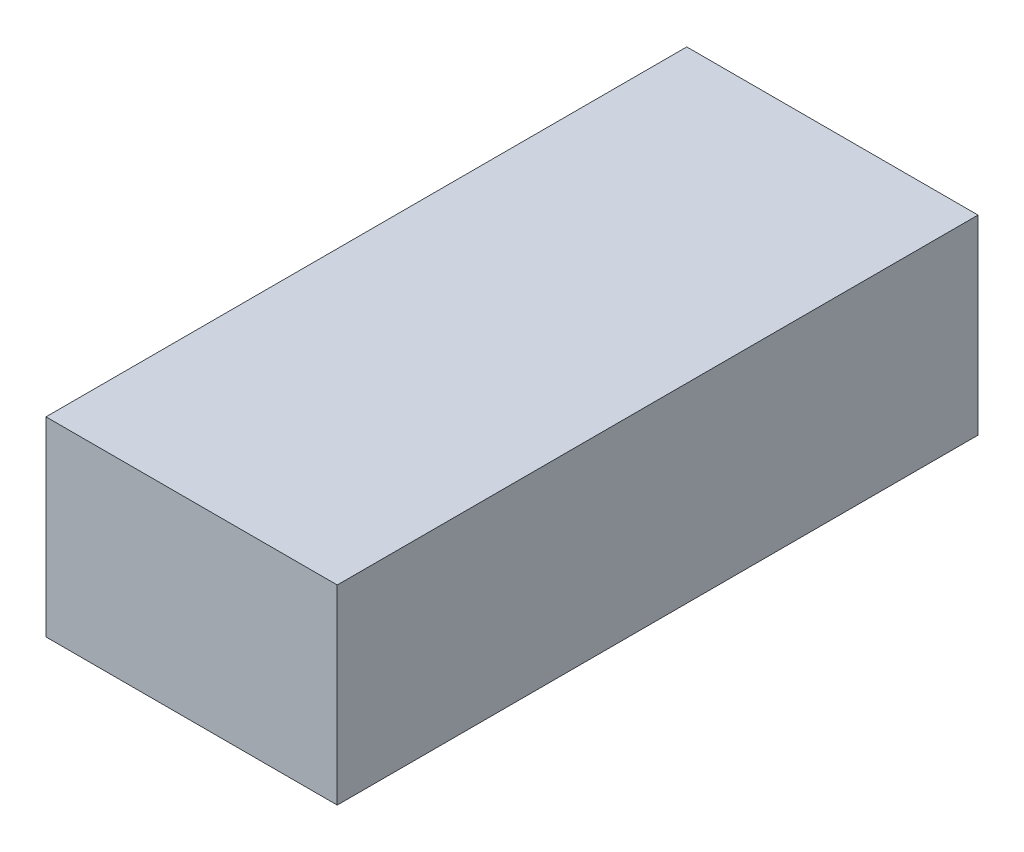
ISO-10303-21;
HEADER;
FILE_DESCRIPTION(('STEP AP214'),'2;1');
FILE_NAME('part.step','',(''),(''),'','','');
FILE_SCHEMA(('AUTOMOTIVE_DESIGN { 1 0 10303 214 1 1 1 1 }'));
ENDSEC;
DATA;
#1=APPLICATION_CONTEXT('core data for automotive mechanical design processes');
#2=APPLICATION_PROTOCOL_DEFINITION('international standard','automotive_design',2000,#1);
#3=PRODUCT_CONTEXT('',#1,'mechanical');
#4=PRODUCT('Part','Part','',(#3));
#5=PRODUCT_RELATED_PRODUCT_CATEGORY('part','',(#4));
#6=PRODUCT_DEFINITION_FORMATION('','',#4);
#7=PRODUCT_DEFINITION_CONTEXT('part definition',#1,'design');
#8=PRODUCT_DEFINITION('design','',#6,#7);
#9=PRODUCT_DEFINITION_SHAPE('','',#8);
#10=(LENGTH_UNIT() NAMED_UNIT(*) SI_UNIT(.MILLI.,.METRE.));
#11=(NAMED_UNIT(*) PLANE_ANGLE_UNIT() SI_UNIT($,.RADIAN.));
#12=(NAMED_UNIT(*) SI_UNIT($,.STERADIAN.) SOLID_ANGLE_UNIT());
#13=UNCERTAINTY_MEASURE_WITH_UNIT(LENGTH_MEASURE(1.E-05),#10,'distance_accuracy_value','');
#14=(GEOMETRIC_REPRESENTATION_CONTEXT(3) GLOBAL_UNCERTAINTY_ASSIGNED_CONTEXT((#13)) GLOBAL_UNIT_ASSIGNED_CONTEXT((#10,
#11,#12)) REPRESENTATION_CONTEXT('',''));
#15=CARTESIAN_POINT('',(0.,0.,0.));
#16=DIRECTION('',(0.,0.,1.));
#17=DIRECTION('',(1.,0.,0.));
#18=AXIS2_PLACEMENT_3D('',#15,#16,#17);
#19=CARTESIAN_POINT('',(0.,0.,0.));
#20=DIRECTION('',(-1.,0.,0.));
#21=DIRECTION('',(0.,0.,1.));
#22=AXIS2_PLACEMENT_3D('',#19,#20,#21);
#23=PLANE('',#22);
#24=DIRECTION('',(0.,1.,0.));
#25=VECTOR('',#24,1.);
#26=CARTESIAN_POINT('',(0.,-36.,-121.));
#27=LINE('',#26,#25);
#28=CARTESIAN_POINT('',(0.,-36.,-121.));
#29=VERTEX_POINT('',#28);
#30=CARTESIAN_POINT('',(0.,36.,-121.));
#31=VERTEX_POINT('',#30);
#32=EDGE_CURVE('E130',#29,#31,#27,.T.);
#33=ORIENTED_EDGE('',*,*,#32,.F.);
#34=DIRECTION('',(0.,0.,-1.));
#35=VECTOR('',#34,1.);
#36=CARTESIAN_POINT('',(0.,-36.,121.));
#37=LINE('',#36,#35);
#38=CARTESIAN_POINT('',(0.,-36.,121.));
#39=VERTEX_POINT('',#38);
#40=EDGE_CURVE('E78',#39,#29,#37,.T.);
#41=ORIENTED_EDGE('',*,*,#40,.F.);
#42=DIRECTION('',(0.,-1.,0.));
#43=VECTOR('',#42,1.);
#44=CARTESIAN_POINT('',(0.,-36.,121.));
#45=LINE('',#44,#43);
#46=CARTESIAN_POINT('',(0.,36.,121.));
#47=VERTEX_POINT('',#46);
#48=EDGE_CURVE('E158',#47,#39,#45,.T.);
#49=ORIENTED_EDGE('',*,*,#48,.F.);
#50=DIRECTION('',(0.,0.,1.));
#51=VECTOR('',#50,1.);
#52=CARTESIAN_POINT('',(0.,36.,121.));
#53=LINE('',#52,#51);
#54=EDGE_CURVE('E134',#31,#47,#53,.T.);
#55=ORIENTED_EDGE('',*,*,#54,.F.);
#56=EDGE_LOOP('',(#33,#41,#49,#55));
#57=FACE_BOUND('',#56,.T.);
#58=DIRECTION('',(0.,0.,-1.));
#59=VECTOR('',#58,1.);
#60=CARTESIAN_POINT('',(0.,-32.,0.));
#61=LINE('',#60,#59);
#62=CARTESIAN_POINT('',(0.,-32.,117.));
#63=VERTEX_POINT('',#62);
#64=CARTESIAN_POINT('',(0.,-32.,-117.));
#65=VERTEX_POINT('',#64);
#66=EDGE_CURVE('E125',#63,#65,#61,.T.);
#67=ORIENTED_EDGE('',*,*,#66,.T.);
#68=DIRECTION('',(0.,1.,0.));
#69=VECTOR('',#68,1.);
#70=CARTESIAN_POINT('',(0.,0.,-117.));
#71=LINE('',#70,#69);
#72=CARTESIAN_POINT('',(0.,32.,-117.));
#73=VERTEX_POINT('',#72);
#74=EDGE_CURVE('E144',#65,#73,#71,.T.);
#75=ORIENTED_EDGE('',*,*,#74,.T.);
#76=DIRECTION('',(0.,0.,1.));
#77=VECTOR('',#76,1.);
#78=CARTESIAN_POINT('',(0.,32.,0.));
#79=LINE('',#78,#77);
#80=CARTESIAN_POINT('',(0.,32.,117.));
#81=VERTEX_POINT('',#80);
#82=EDGE_CURVE('E129',#73,#81,#79,.T.);
#83=ORIENTED_EDGE('',*,*,#82,.T.);
#84=DIRECTION('',(0.,-1.,0.));
#85=VECTOR('',#84,1.);
#86=CARTESIAN_POINT('',(0.,0.,117.));
#87=LINE('',#86,#85);
#88=EDGE_CURVE('E48',#81,#63,#87,.T.);
#89=ORIENTED_EDGE('',*,*,#88,.T.);
#90=EDGE_LOOP('',(#67,#75,#83,#89));
#91=FACE_BOUND('',#90,.T.);
#92=ADVANCED_FACE('F33',(#57,#91),#23,.T.);
#93=CARTESIAN_POINT('',(110.,-36.,-121.));
#94=DIRECTION('',(0.,0.,1.));
#95=DIRECTION('',(1.,0.,0.));
#96=AXIS2_PLACEMENT_3D('',#93,#94,#95);
#97=PLANE('',#96);
#98=ORIENTED_EDGE('',*,*,#32,.T.);
#99=DIRECTION('',(-1.,0.,0.));
#100=VECTOR('',#99,1.);
#101=CARTESIAN_POINT('',(110.,36.,-121.));
#102=LINE('',#101,#100);
#103=CARTESIAN_POINT('',(110.,36.,-121.));
#104=VERTEX_POINT('',#103);
#105=EDGE_CURVE('E11',#104,#31,#102,.T.);
#106=ORIENTED_EDGE('',*,*,#105,.F.);
#107=DIRECTION('',(0.,1.,0.));
#108=VECTOR('',#107,1.);
#109=CARTESIAN_POINT('',(110.,-36.,-121.));
#110=LINE('',#109,#108);
#111=CARTESIAN_POINT('',(110.,-36.,-121.));
#112=VERTEX_POINT('',#111);
#113=EDGE_CURVE('E150',#112,#104,#110,.T.);
#114=ORIENTED_EDGE('',*,*,#113,.F.);
#115=DIRECTION('',(-1.,0.,0.));
#116=VECTOR('',#115,1.);
#117=CARTESIAN_POINT('',(110.,-36.,-121.));
#118=LINE('',#117,#116);
#119=EDGE_CURVE('E155',#112,#29,#118,.T.);
#120=ORIENTED_EDGE('',*,*,#119,.T.);
#121=EDGE_LOOP('',(#98,#106,#114,#120));
#122=FACE_BOUND('',#121,.T.);
#123=ADVANCED_FACE('F35',(#122),#97,.F.);
#124=CARTESIAN_POINT('',(110.,36.,121.));
#125=DIRECTION('',(0.,-1.,0.));
#126=DIRECTION('',(0.,0.,-1.));
#127=AXIS2_PLACEMENT_3D('',#124,#125,#126);
#128=PLANE('',#127);
#129=ORIENTED_EDGE('',*,*,#54,.T.);
#130=DIRECTION('',(-1.,0.,0.));
#131=VECTOR('',#130,1.);
#132=CARTESIAN_POINT('',(110.,36.,121.));
#133=LINE('',#132,#131);
#134=CARTESIAN_POINT('',(110.,36.,121.));
#135=VERTEX_POINT('',#134);
#136=EDGE_CURVE('E41',#135,#47,#133,.T.);
#137=ORIENTED_EDGE('',*,*,#136,.F.);
#138=DIRECTION('',(0.,0.,1.));
#139=VECTOR('',#138,1.);
#140=CARTESIAN_POINT('',(110.,36.,121.));
#141=LINE('',#140,#139);
#142=EDGE_CURVE('E85',#104,#135,#141,.T.);
#143=ORIENTED_EDGE('',*,*,#142,.F.);
#144=ORIENTED_EDGE('',*,*,#105,.T.);
#145=EDGE_LOOP('',(#129,#137,#143,#144));
#146=FACE_BOUND('',#145,.T.);
#147=ADVANCED_FACE('F184',(#146),#128,.F.);
#148=CARTESIAN_POINT('',(110.,-36.,121.));
#149=DIRECTION('',(0.,0.,-1.));
#150=DIRECTION('',(-1.,0.,0.));
#151=AXIS2_PLACEMENT_3D('',#148,#149,#150);
#152=PLANE('',#151);
#153=ORIENTED_EDGE('',*,*,#48,.T.);
#154=DIRECTION('',(-1.,0.,0.));
#155=VECTOR('',#154,1.);
#156=CARTESIAN_POINT('',(110.,-36.,121.));
#157=LINE('',#156,#155);
#158=CARTESIAN_POINT('',(110.,-36.,121.));
#159=VERTEX_POINT('',#158);
#160=EDGE_CURVE('E162',#159,#39,#157,.T.);
#161=ORIENTED_EDGE('',*,*,#160,.F.);
#162=DIRECTION('',(0.,-1.,0.));
#163=VECTOR('',#162,1.);
#164=CARTESIAN_POINT('',(110.,-36.,121.));
#165=LINE('',#164,#163);
#166=EDGE_CURVE('E153',#135,#159,#165,.T.);
#167=ORIENTED_EDGE('',*,*,#166,.F.);
#168=ORIENTED_EDGE('',*,*,#136,.T.);
#169=EDGE_LOOP('',(#153,#161,#167,#168));
#170=FACE_BOUND('',#169,.T.);
#171=ADVANCED_FACE('F167',(#170),#152,.F.);
#172=CARTESIAN_POINT('',(110.,-36.,121.));
#173=DIRECTION('',(0.,1.,0.));
#174=DIRECTION('',(0.,0.,1.));
#175=AXIS2_PLACEMENT_3D('',#172,#173,#174);
#176=PLANE('',#175);
#177=ORIENTED_EDGE('',*,*,#40,.T.);
#178=ORIENTED_EDGE('',*,*,#119,.F.);
#179=DIRECTION('',(0.,0.,-1.));
#180=VECTOR('',#179,1.);
#181=CARTESIAN_POINT('',(110.,-36.,121.));
#182=LINE('',#181,#180);
#183=EDGE_CURVE('E57',#159,#112,#182,.T.);
#184=ORIENTED_EDGE('',*,*,#183,.F.);
#185=ORIENTED_EDGE('',*,*,#160,.T.);
#186=EDGE_LOOP('',(#177,#178,#184,#185));
#187=FACE_BOUND('',#186,.T.);
#188=ADVANCED_FACE('F175',(#187),#176,.F.);
#189=CARTESIAN_POINT('',(110.,0.,0.));
#190=DIRECTION('',(-1.,0.,0.));
#191=DIRECTION('',(0.,0.,1.));
#192=AXIS2_PLACEMENT_3D('',#189,#190,#191);
#193=PLANE('',#192);
#194=ORIENTED_EDGE('',*,*,#113,.T.);
#195=ORIENTED_EDGE('',*,*,#142,.T.);
#196=ORIENTED_EDGE('',*,*,#166,.T.);
#197=ORIENTED_EDGE('',*,*,#183,.T.);
#198=EDGE_LOOP('',(#194,#195,#196,#197));
#199=FACE_BOUND('',#198,.T.);
#200=ADVANCED_FACE('F177',(#199),#193,.F.);
#201=CARTESIAN_POINT('',(110.,-36.,-117.));
#202=DIRECTION('',(0.,0.,1.));
#203=DIRECTION('',(1.,0.,0.));
#204=AXIS2_PLACEMENT_3D('',#201,#202,#203);
#205=PLANE('',#204);
#206=ORIENTED_EDGE('',*,*,#74,.F.);
#207=DIRECTION('',(-1.,0.,0.));
#208=VECTOR('',#207,1.);
#209=CARTESIAN_POINT('',(110.,-32.,-117.));
#210=LINE('',#209,#208);
#211=CARTESIAN_POINT('',(106.,-32.,-117.));
#212=VERTEX_POINT('',#211);
#213=EDGE_CURVE('E124',#212,#65,#210,.T.);
#214=ORIENTED_EDGE('',*,*,#213,.F.);
#215=DIRECTION('',(0.,1.,0.));
#216=VECTOR('',#215,1.);
#217=CARTESIAN_POINT('',(106.,0.,-117.));
#218=LINE('',#217,#216);
#219=CARTESIAN_POINT('',(106.,32.,-117.));
#220=VERTEX_POINT('',#219);
#221=EDGE_CURVE('E112',#212,#220,#218,.T.);
#222=ORIENTED_EDGE('',*,*,#221,.T.);
#223=DIRECTION('',(-1.,0.,0.));
#224=VECTOR('',#223,1.);
#225=CARTESIAN_POINT('',(110.,32.,-117.));
#226=LINE('',#225,#224);
#227=EDGE_CURVE('E122',#220,#73,#226,.T.);
#228=ORIENTED_EDGE('',*,*,#227,.T.);
#229=EDGE_LOOP('',(#206,#214,#222,#228));
#230=FACE_BOUND('',#229,.T.);
#231=ADVANCED_FACE('F121',(#230),#205,.T.);
#232=CARTESIAN_POINT('',(110.,32.,121.));
#233=DIRECTION('',(0.,-1.,0.));
#234=DIRECTION('',(0.,0.,-1.));
#235=AXIS2_PLACEMENT_3D('',#232,#233,#234);
#236=PLANE('',#235);
#237=ORIENTED_EDGE('',*,*,#82,.F.);
#238=ORIENTED_EDGE('',*,*,#227,.F.);
#239=DIRECTION('',(0.,0.,1.));
#240=VECTOR('',#239,1.);
#241=CARTESIAN_POINT('',(106.,32.,0.));
#242=LINE('',#241,#240);
#243=CARTESIAN_POINT('',(106.,32.,117.));
#244=VERTEX_POINT('',#243);
#245=EDGE_CURVE('E108',#220,#244,#242,.T.);
#246=ORIENTED_EDGE('',*,*,#245,.T.);
#247=DIRECTION('',(-1.,0.,0.));
#248=VECTOR('',#247,1.);
#249=CARTESIAN_POINT('',(110.,32.,117.));
#250=LINE('',#249,#248);
#251=EDGE_CURVE('E131',#244,#81,#250,.T.);
#252=ORIENTED_EDGE('',*,*,#251,.T.);
#253=EDGE_LOOP('',(#237,#238,#246,#252));
#254=FACE_BOUND('',#253,.T.);
#255=ADVANCED_FACE('F127',(#254),#236,.T.);
#256=CARTESIAN_POINT('',(110.,-36.,117.));
#257=DIRECTION('',(0.,0.,-1.));
#258=DIRECTION('',(-1.,0.,0.));
#259=AXIS2_PLACEMENT_3D('',#256,#257,#258);
#260=PLANE('',#259);
#261=ORIENTED_EDGE('',*,*,#88,.F.);
#262=ORIENTED_EDGE('',*,*,#251,.F.);
#263=DIRECTION('',(0.,-1.,0.));
#264=VECTOR('',#263,1.);
#265=CARTESIAN_POINT('',(106.,0.,117.));
#266=LINE('',#265,#264);
#267=CARTESIAN_POINT('',(106.,-32.,117.));
#268=VERTEX_POINT('',#267);
#269=EDGE_CURVE('E113',#244,#268,#266,.T.);
#270=ORIENTED_EDGE('',*,*,#269,.T.);
#271=DIRECTION('',(-1.,0.,0.));
#272=VECTOR('',#271,1.);
#273=CARTESIAN_POINT('',(110.,-32.,117.));
#274=LINE('',#273,#272);
#275=EDGE_CURVE('E136',#268,#63,#274,.T.);
#276=ORIENTED_EDGE('',*,*,#275,.T.);
#277=EDGE_LOOP('',(#261,#262,#270,#276));
#278=FACE_BOUND('',#277,.T.);
#279=ADVANCED_FACE('F197',(#278),#260,.T.);
#280=CARTESIAN_POINT('',(110.,-32.,121.));
#281=DIRECTION('',(0.,1.,0.));
#282=DIRECTION('',(0.,0.,1.));
#283=AXIS2_PLACEMENT_3D('',#280,#281,#282);
#284=PLANE('',#283);
#285=ORIENTED_EDGE('',*,*,#66,.F.);
#286=ORIENTED_EDGE('',*,*,#275,.F.);
#287=DIRECTION('',(0.,0.,-1.));
#288=VECTOR('',#287,1.);
#289=CARTESIAN_POINT('',(106.,-32.,0.));
#290=LINE('',#289,#288);
#291=EDGE_CURVE('E139',#268,#212,#290,.T.);
#292=ORIENTED_EDGE('',*,*,#291,.T.);
#293=ORIENTED_EDGE('',*,*,#213,.T.);
#294=EDGE_LOOP('',(#285,#286,#292,#293));
#295=FACE_BOUND('',#294,.T.);
#296=ADVANCED_FACE('F194',(#295),#284,.T.);
#297=CARTESIAN_POINT('',(106.,0.,0.));
#298=DIRECTION('',(-1.,0.,0.));
#299=DIRECTION('',(0.,0.,1.));
#300=AXIS2_PLACEMENT_3D('',#297,#298,#299);
#301=PLANE('',#300);
#302=ORIENTED_EDGE('',*,*,#221,.F.);
#303=ORIENTED_EDGE('',*,*,#291,.F.);
#304=ORIENTED_EDGE('',*,*,#269,.F.);
#305=ORIENTED_EDGE('',*,*,#245,.F.);
#306=EDGE_LOOP('',(#302,#303,#304,#305));
#307=FACE_BOUND('',#306,.T.);
#308=ADVANCED_FACE('F110',(#307),#301,.T.);
#309=CLOSED_SHELL('',(#92,#123,#147,#171,#188,#200,#231,#255,#279,#296,#308));
#310=MANIFOLD_SOLID_BREP('B2',#309);
#311=ADVANCED_BREP_SHAPE_REPRESENTATION('',(#18,#310),#14);
#312=SHAPE_DEFINITION_REPRESENTATION(#9,#311);
ENDSEC;
END-ISO-10303-21;
